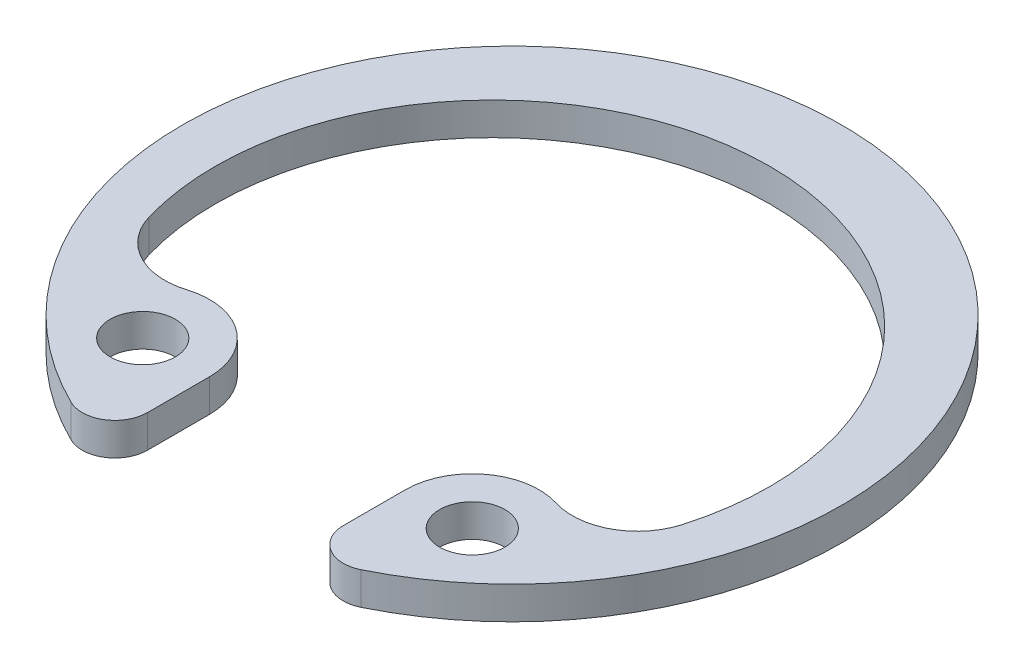
ISO-10303-21;
HEADER;
FILE_DESCRIPTION(('STEP AP214'),'2;1');
FILE_NAME('part.step','',(''),(''),'','','');
FILE_SCHEMA(('AUTOMOTIVE_DESIGN { 1 0 10303 214 1 1 1 1 }'));
ENDSEC;
DATA;
#1=APPLICATION_CONTEXT('core data for automotive mechanical design processes');
#2=APPLICATION_PROTOCOL_DEFINITION('international standard','automotive_design',2000,#1);
#3=PRODUCT_CONTEXT('',#1,'mechanical');
#4=PRODUCT('Part','Part','',(#3));
#5=PRODUCT_RELATED_PRODUCT_CATEGORY('part','',(#4));
#6=PRODUCT_DEFINITION_FORMATION('','',#4);
#7=PRODUCT_DEFINITION_CONTEXT('part definition',#1,'design');
#8=PRODUCT_DEFINITION('design','',#6,#7);
#9=PRODUCT_DEFINITION_SHAPE('','',#8);
#10=(LENGTH_UNIT() NAMED_UNIT(*) SI_UNIT(.MILLI.,.METRE.));
#11=(NAMED_UNIT(*) PLANE_ANGLE_UNIT() SI_UNIT($,.RADIAN.));
#12=(NAMED_UNIT(*) SI_UNIT($,.STERADIAN.) SOLID_ANGLE_UNIT());
#13=UNCERTAINTY_MEASURE_WITH_UNIT(LENGTH_MEASURE(1.E-05),#10,'distance_accuracy_value','');
#14=(GEOMETRIC_REPRESENTATION_CONTEXT(3) GLOBAL_UNCERTAINTY_ASSIGNED_CONTEXT((#13)) GLOBAL_UNIT_ASSIGNED_CONTEXT((#10,
#11,#12)) REPRESENTATION_CONTEXT('',''));
#15=CARTESIAN_POINT('',(0.,0.,0.));
#16=DIRECTION('',(0.,0.,1.));
#17=DIRECTION('',(1.,0.,0.));
#18=AXIS2_PLACEMENT_3D('',#15,#16,#17);
#19=CARTESIAN_POINT('',(3.13364653129045,-1.672914472942,7.57373843861679));
#20=DIRECTION('',(0.,1.,0.));
#21=DIRECTION('',(-1.,0.,0.));
#22=AXIS2_PLACEMENT_3D('',#19,#20,#21);
#23=CYLINDRICAL_SURFACE('',#22,1.);
#24=DIRECTION('',(0.,-1.,0.));
#25=VECTOR('',#24,1.);
#26=CARTESIAN_POINT('',(3.57320697084302,0.327085527058,8.47195145343029));
#27=LINE('',#26,#25);
#28=CARTESIAN_POINT('',(3.57320697084302,1.327085527058,8.47195145343029));
#29=VERTEX_POINT('',#28);
#30=CARTESIAN_POINT('',(3.57320697084302,0.327085527058,8.47195145343029));
#31=VERTEX_POINT('',#30);
#32=EDGE_CURVE('E219',#29,#31,#27,.T.);
#33=ORIENTED_EDGE('',*,*,#32,.F.);
#34=CARTESIAN_POINT('',(3.13364653129045,1.327085527058,7.57373843861679));
#35=DIRECTION('',(0.,-1.,0.));
#36=DIRECTION('',(0.439560439552574,0.,0.898213014813495));
#37=AXIS2_PLACEMENT_3D('',#34,#35,#36);
#38=CIRCLE('',#37,1.);
#39=CARTESIAN_POINT('',(2.13364653129045,1.327085527058,7.57373843861679));
#40=VERTEX_POINT('',#39);
#41=EDGE_CURVE('E210',#29,#40,#38,.T.);
#42=ORIENTED_EDGE('',*,*,#41,.T.);
#43=DIRECTION('',(0.,-1.,0.));
#44=VECTOR('',#43,1.);
#45=CARTESIAN_POINT('',(2.13364653129045,0.327085527058,7.57373843861679));
#46=LINE('',#45,#44);
#47=CARTESIAN_POINT('',(2.13364653129045,0.327085527058,7.57373843861679));
#48=VERTEX_POINT('',#47);
#49=EDGE_CURVE('E140',#40,#48,#46,.T.);
#50=ORIENTED_EDGE('',*,*,#49,.T.);
#51=CARTESIAN_POINT('',(3.13364653129045,0.327085527058,7.57373843861679));
#52=DIRECTION('',(0.,1.,0.));
#53=DIRECTION('',(0.439560439552574,0.,0.898213014813495));
#54=AXIS2_PLACEMENT_3D('',#51,#52,#53);
#55=CIRCLE('',#54,1.);
#56=EDGE_CURVE('E203',#48,#31,#55,.T.);
#57=ORIENTED_EDGE('',*,*,#56,.T.);
#58=EDGE_LOOP('',(#33,#42,#50,#57));
#59=FACE_BOUND('',#58,.T.);
#60=ADVANCED_FACE('F16',(#59),#23,.T.);
#61=CARTESIAN_POINT('',(-5.91635346856645,0.327085527058,5.66897121136114));
#62=DIRECTION('',(0.,1.,0.));
#63=DIRECTION('',(1.,0.,0.));
#64=AXIS2_PLACEMENT_3D('',#61,#62,#63);
#65=CYLINDRICAL_SURFACE('',#64,1.);
#66=CARTESIAN_POINT('',(-5.91635346856645,1.327085527058,5.66897121136114));
#67=DIRECTION('',(0.,-1.,0.));
#68=DIRECTION('',(1.,0.,0.));
#69=AXIS2_PLACEMENT_3D('',#66,#67,#68);
#70=CIRCLE('',#69,1.);
#71=CARTESIAN_POINT('',(-4.91635346856645,1.327085527058,5.66897121136114));
#72=VERTEX_POINT('',#71);
#73=EDGE_CURVE('E167',#72,#72,#70,.T.);
#74=ORIENTED_EDGE('',*,*,#73,.F.);
#75=EDGE_LOOP('',(#74));
#76=FACE_BOUND('',#75,.T.);
#77=CARTESIAN_POINT('',(-5.91635346856645,0.327085527058,5.66897121136114));
#78=DIRECTION('',(0.,1.,0.));
#79=DIRECTION('',(1.,0.,0.));
#80=AXIS2_PLACEMENT_3D('',#77,#78,#79);
#81=CIRCLE('',#80,1.);
#82=CARTESIAN_POINT('',(-4.91635346856645,0.327085527058,5.66897121136114));
#83=VERTEX_POINT('',#82);
#84=EDGE_CURVE('E227',#83,#83,#81,.T.);
#85=ORIENTED_EDGE('',*,*,#84,.F.);
#86=EDGE_LOOP('',(#85));
#87=FACE_BOUND('',#86,.T.);
#88=ADVANCED_FACE('F404',(#76,#87),#65,.F.);
#89=CARTESIAN_POINT('',(-5.91635346856645,0.327085527058,5.66897121136114));
#90=DIRECTION('',(0.,-1.,0.));
#91=DIRECTION('',(-0.295289536025236,0.,-0.955407813404308));
#92=AXIS2_PLACEMENT_3D('',#89,#90,#91);
#93=CYLINDRICAL_SURFACE('',#92,2.05);
#94=CARTESIAN_POINT('',(-5.91635346856645,1.327085527058,5.66897121136114));
#95=DIRECTION('',(0.,1.,0.));
#96=DIRECTION('',(-0.295289536025236,0.,-0.955407813404308));
#97=AXIS2_PLACEMENT_3D('',#94,#95,#96);
#98=CIRCLE('',#97,2.05);
#99=CARTESIAN_POINT('',(-3.86635346856645,1.327085527058,5.66897121136114));
#100=VERTEX_POINT('',#99);
#101=CARTESIAN_POINT('',(-6.52169701741818,1.327085527058,3.71038519388231));
#102=VERTEX_POINT('',#101);
#103=EDGE_CURVE('E133',#100,#102,#98,.T.);
#104=ORIENTED_EDGE('',*,*,#103,.F.);
#105=DIRECTION('',(0.,1.,0.));
#106=VECTOR('',#105,1.);
#107=CARTESIAN_POINT('',(-3.86635346856645,0.327085527058,5.66897121136114));
#108=LINE('',#107,#106);
#109=CARTESIAN_POINT('',(-3.86635346856645,0.327085527058,5.66897121136114));
#110=VERTEX_POINT('',#109);
#111=EDGE_CURVE('E11',#110,#100,#108,.T.);
#112=ORIENTED_EDGE('',*,*,#111,.F.);
#113=CARTESIAN_POINT('',(-5.91635346856645,0.327085527058,5.66897121136114));
#114=DIRECTION('',(0.,-1.,0.));
#115=DIRECTION('',(-0.295289536025236,0.,-0.955407813404308));
#116=AXIS2_PLACEMENT_3D('',#113,#114,#115);
#117=CIRCLE('',#116,2.05);
#118=CARTESIAN_POINT('',(-6.52169701741818,0.327085527058,3.71038519388231));
#119=VERTEX_POINT('',#118);
#120=EDGE_CURVE('E136',#119,#110,#117,.T.);
#121=ORIENTED_EDGE('',*,*,#120,.F.);
#122=DIRECTION('',(0.,1.,0.));
#123=VECTOR('',#122,1.);
#124=CARTESIAN_POINT('',(-6.52169701742024,0.327085527058,3.71038519387564));
#125=LINE('',#124,#123);
#126=EDGE_CURVE('E129',#119,#102,#125,.T.);
#127=ORIENTED_EDGE('',*,*,#126,.T.);
#128=EDGE_LOOP('',(#104,#112,#121,#127));
#129=FACE_BOUND('',#128,.T.);
#130=ADVANCED_FACE('F131',(#129),#93,.T.);
#131=CARTESIAN_POINT('',(-3.86635346856645,0.327085527058,5.66897121136114));
#132=DIRECTION('',(-1.,0.,0.));
#133=DIRECTION('',(0.,0.,1.));
#134=AXIS2_PLACEMENT_3D('',#131,#132,#133);
#135=PLANE('',#134);
#136=DIRECTION('',(0.,1.,0.));
#137=VECTOR('',#136,1.);
#138=CARTESIAN_POINT('',(-3.86635346856644,0.327085527058,7.57373843861679));
#139=LINE('',#138,#137);
#140=CARTESIAN_POINT('',(-3.86635346856644,0.327085527058,7.57373843861679));
#141=VERTEX_POINT('',#140);
#142=CARTESIAN_POINT('',(-3.86635346856645,1.327085527058,7.57373843861679));
#143=VERTEX_POINT('',#142);
#144=EDGE_CURVE('E27',#141,#143,#139,.T.);
#145=ORIENTED_EDGE('',*,*,#144,.F.);
#146=DIRECTION('',(0.,0.,1.));
#147=VECTOR('',#146,1.);
#148=CARTESIAN_POINT('',(-3.86635346856645,0.327085527058,5.66897121136114));
#149=LINE('',#148,#147);
#150=EDGE_CURVE('E198',#110,#141,#149,.T.);
#151=ORIENTED_EDGE('',*,*,#150,.F.);
#152=ORIENTED_EDGE('',*,*,#111,.T.);
#153=DIRECTION('',(0.,0.,-1.));
#154=VECTOR('',#153,1.);
#155=CARTESIAN_POINT('',(-3.86635346856645,1.327085527058,5.66897121136114));
#156=LINE('',#155,#154);
#157=EDGE_CURVE('E156',#143,#100,#156,.T.);
#158=ORIENTED_EDGE('',*,*,#157,.F.);
#159=EDGE_LOOP('',(#145,#151,#152,#158));
#160=FACE_BOUND('',#159,.T.);
#161=ADVANCED_FACE('F358',(#160),#135,.F.);
#162=CARTESIAN_POINT('',(-4.86635346856644,-1.672914472942,7.5737384386168));
#163=DIRECTION('',(0.,-1.,0.));
#164=DIRECTION('',(1.,0.,0.));
#165=AXIS2_PLACEMENT_3D('',#162,#163,#164);
#166=CYLINDRICAL_SURFACE('',#165,1.);
#167=DIRECTION('',(0.,1.,0.));
#168=VECTOR('',#167,1.);
#169=CARTESIAN_POINT('',(-5.30591390811901,0.327085527058,8.47195145343029));
#170=LINE('',#169,#168);
#171=CARTESIAN_POINT('',(-5.30591390811901,0.327085527058,8.47195145343029));
#172=VERTEX_POINT('',#171);
#173=CARTESIAN_POINT('',(-5.30591390811901,1.327085527058,8.47195145343029));
#174=VERTEX_POINT('',#173);
#175=EDGE_CURVE('E175',#172,#174,#170,.T.);
#176=ORIENTED_EDGE('',*,*,#175,.F.);
#177=CARTESIAN_POINT('',(-4.86635346856644,0.327085527058,7.5737384386168));
#178=DIRECTION('',(0.,1.,0.));
#179=DIRECTION('',(-0.439560439552566,0.,0.898213014813499));
#180=AXIS2_PLACEMENT_3D('',#177,#178,#179);
#181=CIRCLE('',#180,1.);
#182=EDGE_CURVE('E224',#172,#141,#181,.T.);
#183=ORIENTED_EDGE('',*,*,#182,.T.);
#184=ORIENTED_EDGE('',*,*,#144,.T.);
#185=CARTESIAN_POINT('',(-4.86635346856644,1.327085527058,7.5737384386168));
#186=DIRECTION('',(0.,-1.,0.));
#187=DIRECTION('',(1.,0.,0.));
#188=AXIS2_PLACEMENT_3D('',#185,#186,#187);
#189=CIRCLE('',#188,1.);
#190=EDGE_CURVE('E163',#143,#174,#189,.T.);
#191=ORIENTED_EDGE('',*,*,#190,.T.);
#192=EDGE_LOOP('',(#176,#183,#184,#191));
#193=FACE_BOUND('',#192,.T.);
#194=ADVANCED_FACE('F363',(#193),#166,.T.);
#195=CARTESIAN_POINT('',(-7.11227608948387,0.327085527058,1.79956956707109));
#196=DIRECTION('',(0.,1.,0.));
#197=DIRECTION('',(-0.960911172454654,0.,0.276856855887339));
#198=AXIS2_PLACEMENT_3D('',#195,#196,#197);
#199=CYLINDRICAL_SURFACE('',#198,2.);
#200=CARTESIAN_POINT('',(-7.11227608948387,1.327085527058,1.79956956707109));
#201=DIRECTION('',(0.,-1.,0.));
#202=DIRECTION('',(-0.960911172454654,0.,0.276856855887339));
#203=AXIS2_PLACEMENT_3D('',#200,#201,#202);
#204=CIRCLE('',#203,2.);
#205=CARTESIAN_POINT('',(-9.03409843439318,1.327085527058,2.35328327884577));
#206=VERTEX_POINT('',#205);
#207=EDGE_CURVE('E143',#102,#206,#204,.T.);
#208=ORIENTED_EDGE('',*,*,#207,.F.);
#209=ORIENTED_EDGE('',*,*,#126,.F.);
#210=CARTESIAN_POINT('',(-7.11227608948387,0.327085527058,1.79956956707109));
#211=DIRECTION('',(0.,1.,0.));
#212=DIRECTION('',(-0.960911172454654,0.,0.276856855887339));
#213=AXIS2_PLACEMENT_3D('',#210,#211,#212);
#214=CIRCLE('',#213,2.);
#215=CARTESIAN_POINT('',(-9.03409843439318,0.327085527058,2.35328327884577));
#216=VERTEX_POINT('',#215);
#217=EDGE_CURVE('E194',#216,#119,#214,.T.);
#218=ORIENTED_EDGE('',*,*,#217,.F.);
#219=DIRECTION('',(0.,1.,0.));
#220=VECTOR('',#219,1.);
#221=CARTESIAN_POINT('',(-9.03409843443101,0.327085527058,2.35328327885666));
#222=LINE('',#221,#220);
#223=EDGE_CURVE('E146',#216,#206,#222,.T.);
#224=ORIENTED_EDGE('',*,*,#223,.T.);
#225=EDGE_LOOP('',(#208,#209,#218,#224));
#226=FACE_BOUND('',#225,.T.);
#227=ADVANCED_FACE('F144',(#226),#199,.F.);
#228=CARTESIAN_POINT('',(2.13364653129045,0.327085527058,20.2000000038143));
#229=DIRECTION('',(1.,0.,0.));
#230=DIRECTION('',(0.,1.,0.));
#231=AXIS2_PLACEMENT_3D('',#228,#229,#230);
#232=PLANE('',#231);
#233=ORIENTED_EDGE('',*,*,#49,.F.);
#234=DIRECTION('',(0.,0.,1.));
#235=VECTOR('',#234,1.);
#236=CARTESIAN_POINT('',(2.13364653129045,1.327085527058,7.57373843861679));
#237=LINE('',#236,#235);
#238=CARTESIAN_POINT('',(2.13364653129045,1.327085527058,5.66897121136114));
#239=VERTEX_POINT('',#238);
#240=EDGE_CURVE('E171',#239,#40,#237,.T.);
#241=ORIENTED_EDGE('',*,*,#240,.F.);
#242=DIRECTION('',(0.,1.,0.));
#243=VECTOR('',#242,1.);
#244=CARTESIAN_POINT('',(2.13364653129045,0.327085527058,5.66897121136114));
#245=LINE('',#244,#243);
#246=CARTESIAN_POINT('',(2.13364653129045,0.327085527058,5.66897121136114));
#247=VERTEX_POINT('',#246);
#248=EDGE_CURVE('E183',#247,#239,#245,.T.);
#249=ORIENTED_EDGE('',*,*,#248,.F.);
#250=DIRECTION('',(0.,0.,-1.));
#251=VECTOR('',#250,1.);
#252=CARTESIAN_POINT('',(2.13364653129045,0.327085527058,7.57373843861679));
#253=LINE('',#252,#251);
#254=EDGE_CURVE('E202',#48,#247,#253,.T.);
#255=ORIENTED_EDGE('',*,*,#254,.F.);
#256=EDGE_LOOP('',(#233,#241,#249,#255));
#257=FACE_BOUND('',#256,.T.);
#258=ADVANCED_FACE('F375',(#257),#232,.F.);
#259=CARTESIAN_POINT('',(4.18364653129045,0.327085527058,5.66897121136114));
#260=DIRECTION('',(0.,-1.,0.));
#261=DIRECTION('',(-1.,0.,0.));
#262=AXIS2_PLACEMENT_3D('',#259,#260,#261);
#263=CYLINDRICAL_SURFACE('',#262,2.05);
#264=CARTESIAN_POINT('',(4.18364653129045,0.327085527058,5.66897121136114));
#265=DIRECTION('',(0.,-1.,0.));
#266=DIRECTION('',(-1.,0.,0.));
#267=AXIS2_PLACEMENT_3D('',#264,#265,#266);
#268=CIRCLE('',#267,2.05);
#269=CARTESIAN_POINT('',(4.78899008014424,0.327085527058,3.71038519387564));
#270=VERTEX_POINT('',#269);
#271=EDGE_CURVE('E195',#247,#270,#268,.T.);
#272=ORIENTED_EDGE('',*,*,#271,.F.);
#273=ORIENTED_EDGE('',*,*,#248,.T.);
#274=CARTESIAN_POINT('',(4.18364653129045,1.327085527058,5.66897121136114));
#275=DIRECTION('',(0.,1.,0.));
#276=DIRECTION('',(-1.,0.,0.));
#277=AXIS2_PLACEMENT_3D('',#274,#275,#276);
#278=CIRCLE('',#277,2.05);
#279=CARTESIAN_POINT('',(4.78899008014424,1.327085527058,3.71038519387564));
#280=VERTEX_POINT('',#279);
#281=EDGE_CURVE('E187',#280,#239,#278,.T.);
#282=ORIENTED_EDGE('',*,*,#281,.F.);
#283=DIRECTION('',(0.,1.,0.));
#284=VECTOR('',#283,1.);
#285=CARTESIAN_POINT('',(4.78899008014218,0.327085527058,3.71038519388231));
#286=LINE('',#285,#284);
#287=EDGE_CURVE('E180',#270,#280,#286,.T.);
#288=ORIENTED_EDGE('',*,*,#287,.F.);
#289=EDGE_LOOP('',(#272,#273,#282,#288));
#290=FACE_BOUND('',#289,.T.);
#291=ADVANCED_FACE('F369',(#290),#263,.T.);
#292=CARTESIAN_POINT('',(5.37956915220787,0.327085527058,1.79956956707109));
#293=DIRECTION('',(0.,1.,0.));
#294=DIRECTION('',(-0.295289536031814,0.,0.955407813402275));
#295=AXIS2_PLACEMENT_3D('',#292,#293,#294);
#296=CYLINDRICAL_SURFACE('',#295,2.);
#297=CARTESIAN_POINT('',(5.37956915220787,0.327085527058,1.79956956707109));
#298=DIRECTION('',(0.,1.,0.));
#299=DIRECTION('',(-0.295289536031814,0.,0.955407813402275));
#300=AXIS2_PLACEMENT_3D('',#297,#298,#299);
#301=CIRCLE('',#300,2.);
#302=CARTESIAN_POINT('',(7.301391497155,0.327085527058,2.35328327885666));
#303=VERTEX_POINT('',#302);
#304=EDGE_CURVE('E190',#270,#303,#301,.T.);
#305=ORIENTED_EDGE('',*,*,#304,.F.);
#306=ORIENTED_EDGE('',*,*,#287,.T.);
#307=CARTESIAN_POINT('',(5.37956915220787,1.327085527058,1.79956956707109));
#308=DIRECTION('',(0.,-1.,0.));
#309=DIRECTION('',(-0.295289536031814,0.,0.955407813402275));
#310=AXIS2_PLACEMENT_3D('',#307,#308,#309);
#311=CIRCLE('',#310,2.);
#312=CARTESIAN_POINT('',(7.301391497155,1.327085527058,2.35328327885666));
#313=VERTEX_POINT('',#312);
#314=EDGE_CURVE('E151',#313,#280,#311,.T.);
#315=ORIENTED_EDGE('',*,*,#314,.F.);
#316=DIRECTION('',(0.,1.,0.));
#317=VECTOR('',#316,1.);
#318=CARTESIAN_POINT('',(7.30139149711718,0.327085527058,2.35328327884577));
#319=LINE('',#318,#317);
#320=EDGE_CURVE('E228',#303,#313,#319,.T.);
#321=ORIENTED_EDGE('',*,*,#320,.F.);
#322=EDGE_LOOP('',(#305,#306,#315,#321));
#323=FACE_BOUND('',#322,.T.);
#324=ADVANCED_FACE('F374',(#323),#296,.F.);
#325=CARTESIAN_POINT('',(4.18364653129045,0.327085527058,5.66897121136114));
#326=DIRECTION('',(0.,1.,0.));
#327=DIRECTION('',(-1.,0.,0.));
#328=AXIS2_PLACEMENT_3D('',#325,#326,#327);
#329=CYLINDRICAL_SURFACE('',#328,1.);
#330=CARTESIAN_POINT('',(4.18364653129045,1.327085527058,5.66897121136114));
#331=DIRECTION('',(0.,-1.,0.));
#332=DIRECTION('',(-1.,0.,0.));
#333=AXIS2_PLACEMENT_3D('',#330,#331,#332);
#334=CIRCLE('',#333,1.);
#335=CARTESIAN_POINT('',(3.18364653129045,1.327085527058,5.66897121136114));
#336=VERTEX_POINT('',#335);
#337=EDGE_CURVE('E170',#336,#336,#334,.T.);
#338=ORIENTED_EDGE('',*,*,#337,.F.);
#339=EDGE_LOOP('',(#338));
#340=FACE_BOUND('',#339,.T.);
#341=CARTESIAN_POINT('',(4.18364653129045,0.327085527058,5.66897121136114));
#342=DIRECTION('',(0.,1.,0.));
#343=DIRECTION('',(-1.,0.,0.));
#344=AXIS2_PLACEMENT_3D('',#341,#342,#343);
#345=CIRCLE('',#344,1.);
#346=CARTESIAN_POINT('',(3.18364653129045,0.327085527058,5.66897121136114));
#347=VERTEX_POINT('',#346);
#348=EDGE_CURVE('E39',#347,#347,#345,.T.);
#349=ORIENTED_EDGE('',*,*,#348,.F.);
#350=EDGE_LOOP('',(#349));
#351=FACE_BOUND('',#350,.T.);
#352=ADVANCED_FACE('F385',(#340,#351),#329,.F.);
#353=CARTESIAN_POINT('',(-0.866353468638,0.327085527058,3.814E-09));
#354=DIRECTION('',(0.,1.,0.));
#355=DIRECTION('',(1.,0.,0.));
#356=AXIS2_PLACEMENT_3D('',#353,#354,#355);
#357=PLANE('',#356);
#358=ORIENTED_EDGE('',*,*,#348,.T.);
#359=EDGE_LOOP('',(#358));
#360=FACE_BOUND('',#359,.T.);
#361=ORIENTED_EDGE('',*,*,#84,.T.);
#362=EDGE_LOOP('',(#361));
#363=FACE_BOUND('',#362,.T.);
#364=ORIENTED_EDGE('',*,*,#56,.F.);
#365=ORIENTED_EDGE('',*,*,#254,.T.);
#366=ORIENTED_EDGE('',*,*,#271,.T.);
#367=ORIENTED_EDGE('',*,*,#304,.T.);
#368=CARTESIAN_POINT('',(-0.866353468709551,0.327085527058,3.81428629629542E-09));
#369=DIRECTION('',(0.,1.,0.));
#370=DIRECTION('',(0.960911172454654,0.,0.276856855887338));
#371=AXIS2_PLACEMENT_3D('',#368,#369,#370);
#372=CIRCLE('',#371,8.5);
#373=EDGE_CURVE('E174',#303,#216,#372,.T.);
#374=ORIENTED_EDGE('',*,*,#373,.T.);
#375=ORIENTED_EDGE('',*,*,#217,.T.);
#376=ORIENTED_EDGE('',*,*,#120,.T.);
#377=ORIENTED_EDGE('',*,*,#150,.T.);
#378=ORIENTED_EDGE('',*,*,#182,.F.);
#379=CARTESIAN_POINT('',(-0.866353468638,0.327085527058,-0.599999996186));
#380=DIRECTION('',(0.,1.,0.));
#381=DIRECTION('',(0.439560439552576,0.,0.898213014813494));
#382=AXIS2_PLACEMENT_3D('',#379,#380,#381);
#383=CIRCLE('',#382,10.1);
#384=EDGE_CURVE('E179',#31,#172,#383,.T.);
#385=ORIENTED_EDGE('',*,*,#384,.F.);
#386=EDGE_LOOP('',(#364,#365,#366,#367,#374,#375,#376,#377,#378,#385));
#387=FACE_BOUND('',#386,.T.);
#388=ADVANCED_FACE('F417',(#360,#363,#387),#357,.F.);
#389=CARTESIAN_POINT('',(-0.866353468638,1.327085527058,3.814E-09));
#390=DIRECTION('',(0.,1.,0.));
#391=DIRECTION('',(1.,0.,0.));
#392=AXIS2_PLACEMENT_3D('',#389,#390,#391);
#393=PLANE('',#392);
#394=ORIENTED_EDGE('',*,*,#337,.T.);
#395=EDGE_LOOP('',(#394));
#396=FACE_BOUND('',#395,.T.);
#397=ORIENTED_EDGE('',*,*,#73,.T.);
#398=EDGE_LOOP('',(#397));
#399=FACE_BOUND('',#398,.T.);
#400=ORIENTED_EDGE('',*,*,#41,.F.);
#401=CARTESIAN_POINT('',(-0.866353468638,1.327085527058,-0.599999996186));
#402=DIRECTION('',(0.,1.,0.));
#403=DIRECTION('',(0.439560439552576,0.,0.898213014813494));
#404=AXIS2_PLACEMENT_3D('',#401,#402,#403);
#405=CIRCLE('',#404,10.1);
#406=EDGE_CURVE('E20',#29,#174,#405,.T.);
#407=ORIENTED_EDGE('',*,*,#406,.T.);
#408=ORIENTED_EDGE('',*,*,#190,.F.);
#409=ORIENTED_EDGE('',*,*,#157,.T.);
#410=ORIENTED_EDGE('',*,*,#103,.T.);
#411=ORIENTED_EDGE('',*,*,#207,.T.);
#412=CARTESIAN_POINT('',(-0.866353468709551,1.327085527058,3.81428629629542E-09));
#413=DIRECTION('',(0.,-1.,0.));
#414=DIRECTION('',(0.960911172454654,0.,0.276856855887338));
#415=AXIS2_PLACEMENT_3D('',#412,#413,#414);
#416=CIRCLE('',#415,8.5);
#417=EDGE_CURVE('E223',#206,#313,#416,.T.);
#418=ORIENTED_EDGE('',*,*,#417,.T.);
#419=ORIENTED_EDGE('',*,*,#314,.T.);
#420=ORIENTED_EDGE('',*,*,#281,.T.);
#421=ORIENTED_EDGE('',*,*,#240,.T.);
#422=EDGE_LOOP('',(#400,#407,#408,#409,#410,#411,#418,#419,#420,#421));
#423=FACE_BOUND('',#422,.T.);
#424=ADVANCED_FACE('F154',(#396,#399,#423),#393,.T.);
#425=CARTESIAN_POINT('',(-0.866353468638,0.327085527058,-0.599999996186));
#426=DIRECTION('',(0.,1.,0.));
#427=DIRECTION('',(1.,0.,0.));
#428=AXIS2_PLACEMENT_3D('',#425,#426,#427);
#429=CYLINDRICAL_SURFACE('',#428,10.1);
#430=ORIENTED_EDGE('',*,*,#32,.T.);
#431=ORIENTED_EDGE('',*,*,#384,.T.);
#432=ORIENTED_EDGE('',*,*,#175,.T.);
#433=ORIENTED_EDGE('',*,*,#406,.F.);
#434=EDGE_LOOP('',(#430,#431,#432,#433));
#435=FACE_BOUND('',#434,.T.);
#436=ADVANCED_FACE('F391',(#435),#429,.T.);
#437=CARTESIAN_POINT('',(-0.866353468566449,0.327085527058,3.81428629629542E-09));
#438=DIRECTION('',(0.,1.,0.));
#439=DIRECTION('',(2.22675823926418E-11,0.,-1.));
#440=AXIS2_PLACEMENT_3D('',#437,#438,#439);
#441=CYLINDRICAL_SURFACE('',#440,8.5);
#442=ORIENTED_EDGE('',*,*,#223,.F.);
#443=ORIENTED_EDGE('',*,*,#373,.F.);
#444=ORIENTED_EDGE('',*,*,#320,.T.);
#445=ORIENTED_EDGE('',*,*,#417,.F.);
#446=EDGE_LOOP('',(#442,#443,#444,#445));
#447=FACE_BOUND('',#446,.T.);
#448=ADVANCED_FACE('F18',(#447),#441,.F.);
#449=CLOSED_SHELL('',(#60,#88,#130,#161,#194,#227,#258,#291,#324,#352,#388,#424,#436,#448));
#450=MANIFOLD_SOLID_BREP('B1',#449);
#451=ADVANCED_BREP_SHAPE_REPRESENTATION('',(#18,#450),#14);
#452=SHAPE_DEFINITION_REPRESENTATION(#9,#451);
ENDSEC;
END-ISO-10303-21;
